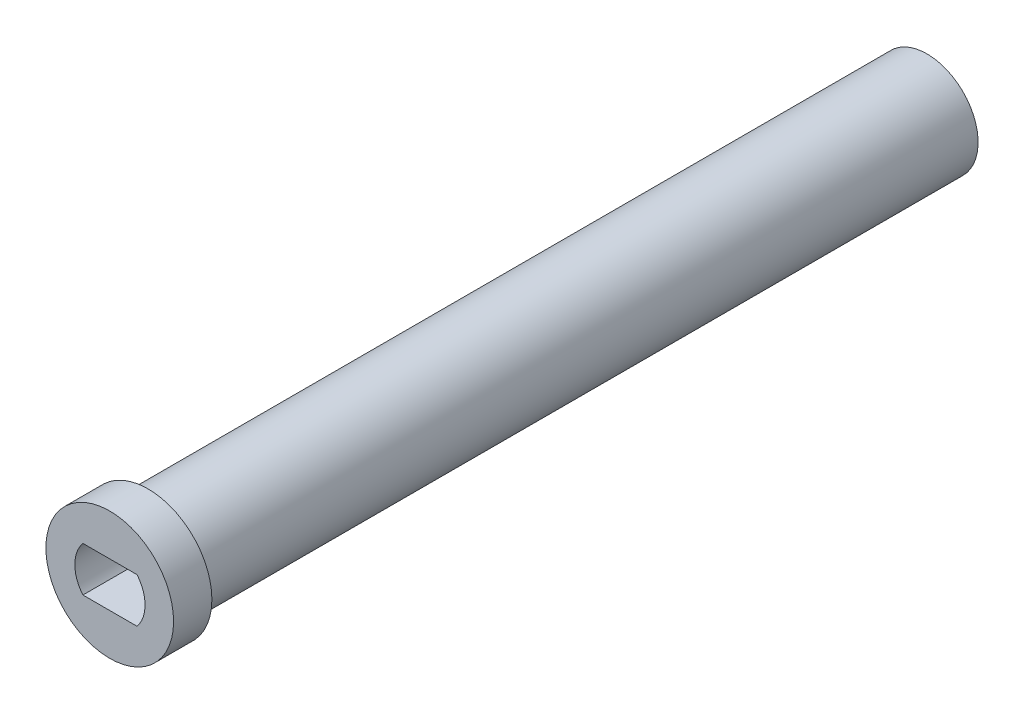
ISO-10303-21;
HEADER;
FILE_DESCRIPTION(('STEP AP214'),'2;1');
FILE_NAME('part.step','',(''),(''),'','','');
FILE_SCHEMA(('AUTOMOTIVE_DESIGN { 1 0 10303 214 1 1 1 1 }'));
ENDSEC;
DATA;
#1=APPLICATION_CONTEXT('core data for automotive mechanical design processes');
#2=APPLICATION_PROTOCOL_DEFINITION('international standard','automotive_design',2000,#1);
#3=PRODUCT_CONTEXT('',#1,'mechanical');
#4=PRODUCT('Part','Part','',(#3));
#5=PRODUCT_RELATED_PRODUCT_CATEGORY('part','',(#4));
#6=PRODUCT_DEFINITION_FORMATION('','',#4);
#7=PRODUCT_DEFINITION_CONTEXT('part definition',#1,'design');
#8=PRODUCT_DEFINITION('design','',#6,#7);
#9=PRODUCT_DEFINITION_SHAPE('','',#8);
#10=(LENGTH_UNIT() NAMED_UNIT(*) SI_UNIT(.MILLI.,.METRE.));
#11=(NAMED_UNIT(*) PLANE_ANGLE_UNIT() SI_UNIT($,.RADIAN.));
#12=(NAMED_UNIT(*) SI_UNIT($,.STERADIAN.) SOLID_ANGLE_UNIT());
#13=UNCERTAINTY_MEASURE_WITH_UNIT(LENGTH_MEASURE(1.E-05),#10,'distance_accuracy_value','');
#14=(GEOMETRIC_REPRESENTATION_CONTEXT(3) GLOBAL_UNCERTAINTY_ASSIGNED_CONTEXT((#13)) GLOBAL_UNIT_ASSIGNED_CONTEXT((#10,
#11,#12)) REPRESENTATION_CONTEXT('',''));
#15=CARTESIAN_POINT('',(0.,0.,0.));
#16=DIRECTION('',(0.,0.,1.));
#17=DIRECTION('',(1.,0.,0.));
#18=AXIS2_PLACEMENT_3D('',#15,#16,#17);
#19=CARTESIAN_POINT('',(0.,0.,40.));
#20=DIRECTION('',(0.,0.,-1.));
#21=DIRECTION('',(-1.,0.,0.));
#22=AXIS2_PLACEMENT_3D('',#19,#20,#21);
#23=CYLINDRICAL_SURFACE('',#22,4.);
#24=CARTESIAN_POINT('',(0.,0.,37.));
#25=DIRECTION('',(0.,0.,1.));
#26=DIRECTION('',(1.,0.,0.));
#27=AXIS2_PLACEMENT_3D('',#24,#25,#26);
#28=CIRCLE('',#27,4.);
#29=CARTESIAN_POINT('',(4.,0.,37.));
#30=VERTEX_POINT('',#29);
#31=EDGE_CURVE('E108',#30,#30,#28,.T.);
#32=ORIENTED_EDGE('',*,*,#31,.F.);
#33=EDGE_LOOP('',(#32));
#34=FACE_BOUND('',#33,.T.);
#35=CARTESIAN_POINT('',(0.,0.,-24.));
#36=DIRECTION('',(0.,0.,-1.));
#37=DIRECTION('',(-1.,0.,0.));
#38=AXIS2_PLACEMENT_3D('',#35,#36,#37);
#39=CIRCLE('',#38,4.);
#40=CARTESIAN_POINT('',(-4.,0.,-24.));
#41=VERTEX_POINT('',#40);
#42=EDGE_CURVE('E98',#41,#41,#39,.T.);
#43=ORIENTED_EDGE('',*,*,#42,.F.);
#44=EDGE_LOOP('',(#43));
#45=FACE_BOUND('',#44,.T.);
#46=ADVANCED_FACE('F39',(#34,#45),#23,.T.);
#47=CARTESIAN_POINT('',(0.00365437001625469,0.,40.));
#48=DIRECTION('',(0.,0.,-1.));
#49=DIRECTION('',(-1.,0.,0.));
#50=AXIS2_PLACEMENT_3D('',#47,#48,#49);
#51=CYLINDRICAL_SURFACE('',#50,2.73684937714953);
#52=CARTESIAN_POINT('',(0.00365437001625469,0.,23.));
#53=DIRECTION('',(0.,0.,1.));
#54=DIRECTION('',(1.,0.,0.));
#55=AXIS2_PLACEMENT_3D('',#52,#53,#54);
#56=CIRCLE('',#55,2.73684937714953);
#57=CARTESIAN_POINT('',(-2.10059003432555,1.75,23.));
#58=VERTEX_POINT('',#57);
#59=CARTESIAN_POINT('',(-2.10059003432555,-1.75,23.));
#60=VERTEX_POINT('',#59);
#61=EDGE_CURVE('E91',#58,#60,#56,.T.);
#62=ORIENTED_EDGE('',*,*,#61,.F.);
#63=DIRECTION('',(0.,0.,-1.));
#64=VECTOR('',#63,1.);
#65=CARTESIAN_POINT('',(-2.10059003432555,1.75,40.));
#66=LINE('',#65,#64);
#67=CARTESIAN_POINT('',(-2.10059003432555,1.75,40.));
#68=VERTEX_POINT('',#67);
#69=EDGE_CURVE('E79',#68,#58,#66,.T.);
#70=ORIENTED_EDGE('',*,*,#69,.F.);
#71=CARTESIAN_POINT('',(0.00365437001625469,0.,40.));
#72=DIRECTION('',(0.,0.,1.));
#73=DIRECTION('',(1.,0.,0.));
#74=AXIS2_PLACEMENT_3D('',#71,#72,#73);
#75=CIRCLE('',#74,2.73684937714953);
#76=CARTESIAN_POINT('',(-2.10059003432555,-1.75,40.));
#77=VERTEX_POINT('',#76);
#78=EDGE_CURVE('E46',#68,#77,#75,.T.);
#79=ORIENTED_EDGE('',*,*,#78,.T.);
#80=DIRECTION('',(0.,0.,-1.));
#81=VECTOR('',#80,1.);
#82=CARTESIAN_POINT('',(-2.10059003432555,-1.75,40.));
#83=LINE('',#82,#81);
#84=EDGE_CURVE('E93',#77,#60,#83,.T.);
#85=ORIENTED_EDGE('',*,*,#84,.T.);
#86=EDGE_LOOP('',(#62,#70,#79,#85));
#87=FACE_BOUND('',#86,.T.);
#88=ADVANCED_FACE('F92',(#87),#51,.F.);
#89=CARTESIAN_POINT('',(-2.10059003432555,-1.75,40.));
#90=DIRECTION('',(0.,1.,0.));
#91=DIRECTION('',(0.,0.,1.));
#92=AXIS2_PLACEMENT_3D('',#89,#90,#91);
#93=PLANE('',#92);
#94=DIRECTION('',(1.,0.,0.));
#95=VECTOR('',#94,1.);
#96=CARTESIAN_POINT('',(-2.10059003432555,-1.75,23.));
#97=LINE('',#96,#95);
#98=CARTESIAN_POINT('',(2.14205065279374,-1.75,23.));
#99=VERTEX_POINT('',#98);
#100=EDGE_CURVE('E53',#60,#99,#97,.T.);
#101=ORIENTED_EDGE('',*,*,#100,.F.);
#102=ORIENTED_EDGE('',*,*,#84,.F.);
#103=DIRECTION('',(-1.,0.,0.));
#104=VECTOR('',#103,1.);
#105=CARTESIAN_POINT('',(0.,-1.75,40.));
#106=LINE('',#105,#104);
#107=CARTESIAN_POINT('',(2.14205065279373,-1.75,40.));
#108=VERTEX_POINT('',#107);
#109=EDGE_CURVE('E119',#108,#77,#106,.T.);
#110=ORIENTED_EDGE('',*,*,#109,.F.);
#111=DIRECTION('',(0.,0.,-1.));
#112=VECTOR('',#111,1.);
#113=CARTESIAN_POINT('',(2.14205065279374,-1.75,40.));
#114=LINE('',#113,#112);
#115=EDGE_CURVE('E112',#108,#99,#114,.T.);
#116=ORIENTED_EDGE('',*,*,#115,.T.);
#117=EDGE_LOOP('',(#101,#102,#110,#116));
#118=FACE_BOUND('',#117,.T.);
#119=ADVANCED_FACE('F126',(#118),#93,.T.);
#120=CARTESIAN_POINT('',(0.,0.,40.));
#121=DIRECTION('',(0.,0.,-1.));
#122=DIRECTION('',(-1.,0.,0.));
#123=AXIS2_PLACEMENT_3D('',#120,#121,#122);
#124=CYLINDRICAL_SURFACE('',#123,2.76602259555739);
#125=CARTESIAN_POINT('',(0.,0.,23.));
#126=DIRECTION('',(0.,0.,1.));
#127=DIRECTION('',(1.,0.,0.));
#128=AXIS2_PLACEMENT_3D('',#125,#126,#127);
#129=CIRCLE('',#128,2.76602259555739);
#130=CARTESIAN_POINT('',(2.14205065279373,1.75,23.));
#131=VERTEX_POINT('',#130);
#132=EDGE_CURVE('E61',#99,#131,#129,.T.);
#133=ORIENTED_EDGE('',*,*,#132,.F.);
#134=ORIENTED_EDGE('',*,*,#115,.F.);
#135=CARTESIAN_POINT('',(0.,0.,40.));
#136=DIRECTION('',(0.,0.,1.));
#137=DIRECTION('',(1.,0.,0.));
#138=AXIS2_PLACEMENT_3D('',#135,#136,#137);
#139=CIRCLE('',#138,2.76602259555739);
#140=CARTESIAN_POINT('',(2.14205065279373,1.75,40.));
#141=VERTEX_POINT('',#140);
#142=EDGE_CURVE('E116',#108,#141,#139,.T.);
#143=ORIENTED_EDGE('',*,*,#142,.T.);
#144=DIRECTION('',(0.,0.,-1.));
#145=VECTOR('',#144,1.);
#146=CARTESIAN_POINT('',(2.14205065279373,1.75,40.));
#147=LINE('',#146,#145);
#148=EDGE_CURVE('E87',#141,#131,#147,.T.);
#149=ORIENTED_EDGE('',*,*,#148,.T.);
#150=EDGE_LOOP('',(#133,#134,#143,#149));
#151=FACE_BOUND('',#150,.T.);
#152=ADVANCED_FACE('F127',(#151),#124,.F.);
#153=CARTESIAN_POINT('',(-2.10059003432555,1.75,40.));
#154=DIRECTION('',(0.,-1.,0.));
#155=DIRECTION('',(0.,0.,-1.));
#156=AXIS2_PLACEMENT_3D('',#153,#154,#155);
#157=PLANE('',#156);
#158=DIRECTION('',(-1.,0.,0.));
#159=VECTOR('',#158,1.);
#160=CARTESIAN_POINT('',(-2.10059003432555,1.75,23.));
#161=LINE('',#160,#159);
#162=EDGE_CURVE('E11',#131,#58,#161,.T.);
#163=ORIENTED_EDGE('',*,*,#162,.F.);
#164=ORIENTED_EDGE('',*,*,#148,.F.);
#165=DIRECTION('',(-1.,0.,0.));
#166=VECTOR('',#165,1.);
#167=CARTESIAN_POINT('',(0.,1.75,40.));
#168=LINE('',#167,#166);
#169=EDGE_CURVE('E83',#141,#68,#168,.T.);
#170=ORIENTED_EDGE('',*,*,#169,.T.);
#171=ORIENTED_EDGE('',*,*,#69,.T.);
#172=EDGE_LOOP('',(#163,#164,#170,#171));
#173=FACE_BOUND('',#172,.T.);
#174=ADVANCED_FACE('F81',(#173),#157,.T.);
#175=CARTESIAN_POINT('',(0.,0.,37.));
#176=DIRECTION('',(0.,0.,1.));
#177=DIRECTION('',(1.,0.,0.));
#178=AXIS2_PLACEMENT_3D('',#175,#176,#177);
#179=PLANE('',#178);
#180=CARTESIAN_POINT('',(0.,0.,37.));
#181=DIRECTION('',(0.,0.,1.));
#182=DIRECTION('',(1.,0.,0.));
#183=AXIS2_PLACEMENT_3D('',#180,#181,#182);
#184=CIRCLE('',#183,5.);
#185=CARTESIAN_POINT('',(5.,0.,37.));
#186=VERTEX_POINT('',#185);
#187=EDGE_CURVE('E88',#186,#186,#184,.T.);
#188=ORIENTED_EDGE('',*,*,#187,.F.);
#189=EDGE_LOOP('',(#188));
#190=FACE_BOUND('',#189,.T.);
#191=ORIENTED_EDGE('',*,*,#31,.T.);
#192=EDGE_LOOP('',(#191));
#193=FACE_BOUND('',#192,.T.);
#194=ADVANCED_FACE('F134',(#190,#193),#179,.F.);
#195=CARTESIAN_POINT('',(0.,0.,37.));
#196=DIRECTION('',(0.,0.,1.));
#197=DIRECTION('',(1.,0.,0.));
#198=AXIS2_PLACEMENT_3D('',#195,#196,#197);
#199=CYLINDRICAL_SURFACE('',#198,5.);
#200=ORIENTED_EDGE('',*,*,#187,.T.);
#201=EDGE_LOOP('',(#200));
#202=FACE_BOUND('',#201,.T.);
#203=CARTESIAN_POINT('',(0.,0.,40.));
#204=DIRECTION('',(0.,0.,1.));
#205=DIRECTION('',(1.,0.,0.));
#206=AXIS2_PLACEMENT_3D('',#203,#204,#205);
#207=CIRCLE('',#206,5.);
#208=CARTESIAN_POINT('',(5.,0.,40.));
#209=VERTEX_POINT('',#208);
#210=EDGE_CURVE('E95',#209,#209,#207,.T.);
#211=ORIENTED_EDGE('',*,*,#210,.F.);
#212=EDGE_LOOP('',(#211));
#213=FACE_BOUND('',#212,.T.);
#214=ADVANCED_FACE('F157',(#202,#213),#199,.T.);
#215=CARTESIAN_POINT('',(0.,0.,40.));
#216=DIRECTION('',(0.,0.,1.));
#217=DIRECTION('',(1.,0.,0.));
#218=AXIS2_PLACEMENT_3D('',#215,#216,#217);
#219=PLANE('',#218);
#220=ORIENTED_EDGE('',*,*,#78,.F.);
#221=ORIENTED_EDGE('',*,*,#169,.F.);
#222=ORIENTED_EDGE('',*,*,#142,.F.);
#223=ORIENTED_EDGE('',*,*,#109,.T.);
#224=EDGE_LOOP('',(#220,#221,#222,#223));
#225=FACE_BOUND('',#224,.T.);
#226=ORIENTED_EDGE('',*,*,#210,.T.);
#227=EDGE_LOOP('',(#226));
#228=FACE_BOUND('',#227,.T.);
#229=ADVANCED_FACE('F124',(#225,#228),#219,.T.);
#230=CARTESIAN_POINT('',(0.,0.,23.));
#231=DIRECTION('',(0.,0.,1.));
#232=DIRECTION('',(1.,0.,0.));
#233=AXIS2_PLACEMENT_3D('',#230,#231,#232);
#234=PLANE('',#233);
#235=ORIENTED_EDGE('',*,*,#162,.T.);
#236=ORIENTED_EDGE('',*,*,#61,.T.);
#237=ORIENTED_EDGE('',*,*,#100,.T.);
#238=ORIENTED_EDGE('',*,*,#132,.T.);
#239=EDGE_LOOP('',(#235,#236,#237,#238));
#240=FACE_BOUND('',#239,.T.);
#241=ADVANCED_FACE('F97',(#240),#234,.T.);
#242=CARTESIAN_POINT('',(0.,0.,-24.));
#243=DIRECTION('',(0.,0.,-1.));
#244=DIRECTION('',(-1.,0.,0.));
#245=AXIS2_PLACEMENT_3D('',#242,#243,#244);
#246=PLANE('',#245);
#247=ORIENTED_EDGE('',*,*,#42,.T.);
#248=EDGE_LOOP('',(#247));
#249=FACE_BOUND('',#248,.T.);
#250=ADVANCED_FACE('F147',(#249),#246,.T.);
#251=CLOSED_SHELL('',(#46,#88,#119,#152,#174,#194,#214,#229,#241,#250));
#252=MANIFOLD_SOLID_BREP('B2',#251);
#253=ADVANCED_BREP_SHAPE_REPRESENTATION('',(#18,#252),#14);
#254=SHAPE_DEFINITION_REPRESENTATION(#9,#253);
ENDSEC;
END-ISO-10303-21;
